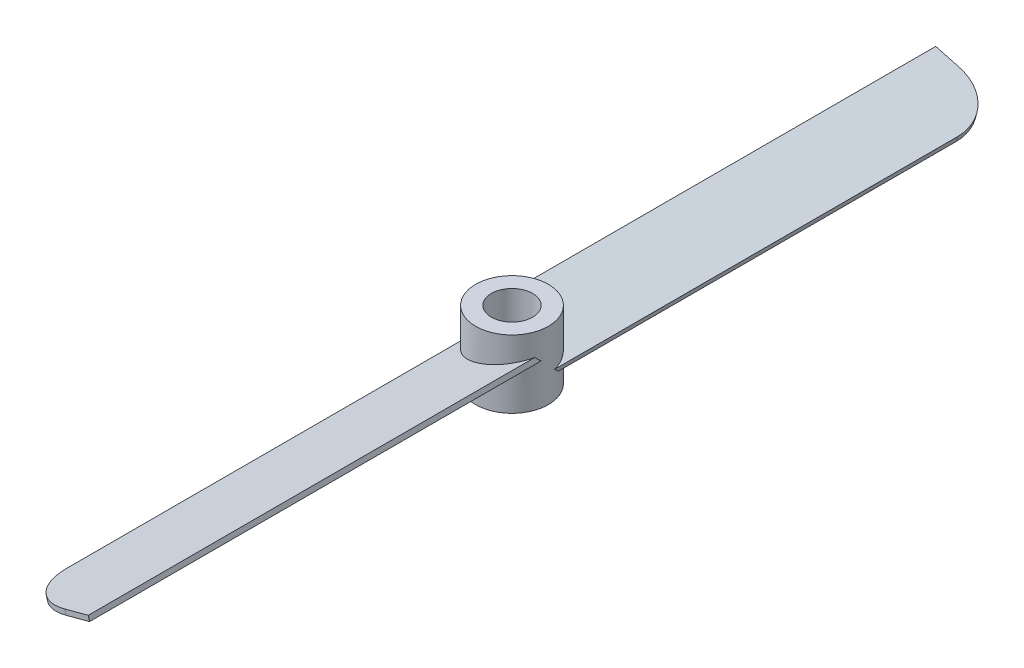
ISO-10303-21;
HEADER;
FILE_DESCRIPTION(('STEP AP214'),'2;1');
FILE_NAME('part.step','',(''),(''),'','','');
FILE_SCHEMA(('AUTOMOTIVE_DESIGN { 1 0 10303 214 1 1 1 1 }'));
ENDSEC;
DATA;
#1=APPLICATION_CONTEXT('core data for automotive mechanical design processes');
#2=APPLICATION_PROTOCOL_DEFINITION('international standard','automotive_design',2000,#1);
#3=PRODUCT_CONTEXT('',#1,'mechanical');
#4=PRODUCT('Part','Part','',(#3));
#5=PRODUCT_RELATED_PRODUCT_CATEGORY('part','',(#4));
#6=PRODUCT_DEFINITION_FORMATION('','',#4);
#7=PRODUCT_DEFINITION_CONTEXT('part definition',#1,'design');
#8=PRODUCT_DEFINITION('design','',#6,#7);
#9=PRODUCT_DEFINITION_SHAPE('','',#8);
#10=(LENGTH_UNIT() NAMED_UNIT(*) SI_UNIT(.MILLI.,.METRE.));
#11=(NAMED_UNIT(*) PLANE_ANGLE_UNIT() SI_UNIT($,.RADIAN.));
#12=(NAMED_UNIT(*) SI_UNIT($,.STERADIAN.) SOLID_ANGLE_UNIT());
#13=UNCERTAINTY_MEASURE_WITH_UNIT(LENGTH_MEASURE(1.E-05),#10,'distance_accuracy_value','');
#14=(GEOMETRIC_REPRESENTATION_CONTEXT(3) GLOBAL_UNCERTAINTY_ASSIGNED_CONTEXT((#13)) GLOBAL_UNIT_ASSIGNED_CONTEXT((#10,
#11,#12)) REPRESENTATION_CONTEXT('',''));
#15=CARTESIAN_POINT('',(0.,0.,0.));
#16=DIRECTION('',(0.,0.,1.));
#17=DIRECTION('',(1.,0.,0.));
#18=AXIS2_PLACEMENT_3D('',#15,#16,#17);
#19=CARTESIAN_POINT('',(0.,14.,0.));
#20=DIRECTION('',(0.,-1.,0.));
#21=DIRECTION('',(0.,0.,-1.));
#22=AXIS2_PLACEMENT_3D('',#19,#20,#21);
#23=CYLINDRICAL_SURFACE('',#22,7.5);
#24=CARTESIAN_POINT('',(0.,-21.9777747886716,0.));
#25=DIRECTION('',(-0.965925826289067,0.258819045102524,0.));
#26=DIRECTION('',(-0.258819045102524,-0.965925826289067,0.));
#27=AXIS2_PLACEMENT_3D('',#24,#25,#26);
#28=ELLIPSE('',#27,28.9777747886716,7.5);
#29=CARTESIAN_POINT('',(7.11046910095244,4.55885716173106,-2.38562972072381));
#30=VERTEX_POINT('',#29);
#31=CARTESIAN_POINT('',(7.37841829338357,5.55885716173106,-1.3449696977489));
#32=VERTEX_POINT('',#31);
#33=EDGE_CURVE('E124',#30,#32,#28,.F.);
#34=ORIENTED_EDGE('',*,*,#33,.T.);
#35=CARTESIAN_POINT('',(0.,7.53589838486225,0.));
#36=DIRECTION('',(0.258819045102525,0.965925826289067,0.));
#37=DIRECTION('',(0.965925826289067,-0.258819045102525,0.));
#38=AXIS2_PLACEMENT_3D('',#35,#36,#37);
#39=ELLIPSE('',#38,7.76457135307563,7.5);
#40=CARTESIAN_POINT('',(-7.11046910095244,9.44114283826893,-2.38562972072377));
#41=VERTEX_POINT('',#40);
#42=EDGE_CURVE('E116',#32,#41,#39,.T.);
#43=ORIENTED_EDGE('',*,*,#42,.T.);
#44=CARTESIAN_POINT('',(0.,35.9777747886716,0.));
#45=DIRECTION('',(-0.965925826289067,0.258819045102525,0.));
#46=DIRECTION('',(-0.258819045102525,-0.965925826289067,0.));
#47=AXIS2_PLACEMENT_3D('',#44,#45,#46);
#48=ELLIPSE('',#47,28.9777747886716,7.5);
#49=CARTESIAN_POINT('',(-7.37841829338357,8.44114283826893,-1.34496969774885));
#50=VERTEX_POINT('',#49);
#51=EDGE_CURVE('E121',#50,#41,#48,.F.);
#52=ORIENTED_EDGE('',*,*,#51,.F.);
#53=CARTESIAN_POINT('',(0.,6.46410161513775,0.));
#54=DIRECTION('',(0.258819045102525,0.965925826289067,0.));
#55=DIRECTION('',(0.965925826289067,-0.258819045102525,0.));
#56=AXIS2_PLACEMENT_3D('',#53,#54,#55);
#57=ELLIPSE('',#56,7.76457135307563,7.5);
#58=EDGE_CURVE('E127',#30,#50,#57,.T.);
#59=ORIENTED_EDGE('',*,*,#58,.F.);
#60=EDGE_LOOP('',(#34,#43,#52,#59));
#61=FACE_BOUND('',#60,.T.);
#62=CARTESIAN_POINT('',(0.,14.,0.));
#63=DIRECTION('',(0.,1.,0.));
#64=DIRECTION('',(0.,0.,1.));
#65=AXIS2_PLACEMENT_3D('',#62,#63,#64);
#66=CIRCLE('',#65,7.5);
#67=CARTESIAN_POINT('',(0.,14.,7.5));
#68=VERTEX_POINT('',#67);
#69=EDGE_CURVE('E203',#68,#68,#66,.T.);
#70=ORIENTED_EDGE('',*,*,#69,.F.);
#71=EDGE_LOOP('',(#70));
#72=FACE_BOUND('',#71,.T.);
#73=CARTESIAN_POINT('',(0.,0.,0.));
#74=DIRECTION('',(0.,1.,0.));
#75=DIRECTION('',(0.,0.,1.));
#76=AXIS2_PLACEMENT_3D('',#73,#74,#75);
#77=CIRCLE('',#76,7.5);
#78=CARTESIAN_POINT('',(0.,0.,7.5));
#79=VERTEX_POINT('',#78);
#80=EDGE_CURVE('E202',#79,#79,#77,.T.);
#81=ORIENTED_EDGE('',*,*,#80,.T.);
#82=EDGE_LOOP('',(#81));
#83=FACE_BOUND('',#82,.T.);
#84=CARTESIAN_POINT('',(0.,-21.9777747886716,0.));
#85=DIRECTION('',(0.965925826289067,0.258819045102524,0.));
#86=DIRECTION('',(0.258819045102525,-0.965925826289067,0.));
#87=AXIS2_PLACEMENT_3D('',#84,#85,#86);
#88=ELLIPSE('',#87,28.9777747886716,7.5);
#89=CARTESIAN_POINT('',(-7.11046910095244,4.55885716173106,2.38562972072381));
#90=VERTEX_POINT('',#89);
#91=CARTESIAN_POINT('',(-7.37841829338357,5.55885716173106,1.3449696977489));
#92=VERTEX_POINT('',#91);
#93=EDGE_CURVE('E166',#90,#92,#88,.F.);
#94=ORIENTED_EDGE('',*,*,#93,.T.);
#95=CARTESIAN_POINT('',(0.,7.53589838486225,0.));
#96=DIRECTION('',(-0.258819045102525,0.965925826289067,0.));
#97=DIRECTION('',(-0.965925826289067,-0.258819045102525,0.));
#98=AXIS2_PLACEMENT_3D('',#95,#96,#97);
#99=ELLIPSE('',#98,7.76457135307563,7.5);
#100=CARTESIAN_POINT('',(7.11046910095244,9.44114283826893,2.38562972072377));
#101=VERTEX_POINT('',#100);
#102=EDGE_CURVE('E213',#92,#101,#99,.T.);
#103=ORIENTED_EDGE('',*,*,#102,.T.);
#104=CARTESIAN_POINT('',(0.,35.9777747886716,0.));
#105=DIRECTION('',(0.965925826289067,0.258819045102525,0.));
#106=DIRECTION('',(0.258819045102525,-0.965925826289067,0.));
#107=AXIS2_PLACEMENT_3D('',#104,#105,#106);
#108=ELLIPSE('',#107,28.9777747886716,7.5);
#109=CARTESIAN_POINT('',(7.37841829338357,8.44114283826893,1.34496969774889));
#110=VERTEX_POINT('',#109);
#111=EDGE_CURVE('E157',#110,#101,#108,.F.);
#112=ORIENTED_EDGE('',*,*,#111,.F.);
#113=CARTESIAN_POINT('',(0.,6.46410161513775,0.));
#114=DIRECTION('',(-0.258819045102525,0.965925826289067,0.));
#115=DIRECTION('',(-0.965925826289067,-0.258819045102525,0.));
#116=AXIS2_PLACEMENT_3D('',#113,#114,#115);
#117=ELLIPSE('',#116,7.76457135307563,7.5);
#118=EDGE_CURVE('E207',#90,#110,#117,.T.);
#119=ORIENTED_EDGE('',*,*,#118,.F.);
#120=EDGE_LOOP('',(#94,#103,#112,#119));
#121=FACE_BOUND('',#120,.T.);
#122=ADVANCED_FACE('F39',(#61,#72,#83,#121),#23,.T.);
#123=CARTESIAN_POINT('',(0.,14.,0.));
#124=DIRECTION('',(0.,1.,0.));
#125=DIRECTION('',(0.,0.,1.));
#126=AXIS2_PLACEMENT_3D('',#123,#124,#125);
#127=PLANE('',#126);
#128=CARTESIAN_POINT('',(0.,14.,0.));
#129=DIRECTION('',(0.,1.,0.));
#130=DIRECTION('',(0.,0.,1.));
#131=AXIS2_PLACEMENT_3D('',#128,#129,#130);
#132=CIRCLE('',#131,4.25);
#133=CARTESIAN_POINT('',(0.,14.,4.25));
#134=VERTEX_POINT('',#133);
#135=EDGE_CURVE('E184',#134,#134,#132,.T.);
#136=ORIENTED_EDGE('',*,*,#135,.F.);
#137=EDGE_LOOP('',(#136));
#138=FACE_BOUND('',#137,.T.);
#139=ORIENTED_EDGE('',*,*,#69,.T.);
#140=EDGE_LOOP('',(#139));
#141=FACE_BOUND('',#140,.T.);
#142=ADVANCED_FACE('F254',(#138,#141),#127,.T.);
#143=CARTESIAN_POINT('',(0.,0.,0.));
#144=DIRECTION('',(0.,1.,0.));
#145=DIRECTION('',(0.,0.,1.));
#146=AXIS2_PLACEMENT_3D('',#143,#144,#145);
#147=PLANE('',#146);
#148=CARTESIAN_POINT('',(0.,0.,0.));
#149=DIRECTION('',(0.,1.,0.));
#150=DIRECTION('',(0.,0.,1.));
#151=AXIS2_PLACEMENT_3D('',#148,#149,#150);
#152=CIRCLE('',#151,4.25);
#153=CARTESIAN_POINT('',(0.,0.,4.25));
#154=VERTEX_POINT('',#153);
#155=EDGE_CURVE('E198',#154,#154,#152,.F.);
#156=ORIENTED_EDGE('',*,*,#155,.F.);
#157=EDGE_LOOP('',(#156));
#158=FACE_BOUND('',#157,.T.);
#159=ORIENTED_EDGE('',*,*,#80,.F.);
#160=EDGE_LOOP('',(#159));
#161=FACE_BOUND('',#160,.T.);
#162=ADVANCED_FACE('F259',(#158,#161),#147,.F.);
#163=CARTESIAN_POINT('',(0.,-0.000999999999999265,0.));
#164=DIRECTION('',(0.,1.,0.));
#165=DIRECTION('',(0.,0.,1.));
#166=AXIS2_PLACEMENT_3D('',#163,#164,#165);
#167=CYLINDRICAL_SURFACE('',#166,4.25);
#168=CARTESIAN_POINT('',(0.,14.,4.25));
#169=CARTESIAN_POINT('',(0.,13.8541666666667,4.25));
#170=CARTESIAN_POINT('',(0.,13.7083333333333,4.25));
#171=CARTESIAN_POINT('',(0.,13.4166666666667,4.25));
#172=CARTESIAN_POINT('',(0.,13.2708333333333,4.25));
#173=CARTESIAN_POINT('',(0.,12.9791666666667,4.25));
#174=CARTESIAN_POINT('',(0.,12.8333333333333,4.25));
#175=CARTESIAN_POINT('',(0.,12.5416666666667,4.25));
#176=CARTESIAN_POINT('',(0.,12.3958333333333,4.25));
#177=CARTESIAN_POINT('',(0.,12.1041666666667,4.25));
#178=CARTESIAN_POINT('',(0.,11.9583333333333,4.25));
#179=CARTESIAN_POINT('',(0.,11.6666666666667,4.25));
#180=CARTESIAN_POINT('',(0.,11.5208333333333,4.25));
#181=CARTESIAN_POINT('',(0.,11.2291666666667,4.25));
#182=CARTESIAN_POINT('',(0.,11.0833333333333,4.25));
#183=CARTESIAN_POINT('',(0.,10.7916666666667,4.25));
#184=CARTESIAN_POINT('',(0.,10.6458333333333,4.25));
#185=CARTESIAN_POINT('',(0.,10.3541666666667,4.25));
#186=CARTESIAN_POINT('',(0.,10.2083333333333,4.25));
#187=CARTESIAN_POINT('',(0.,9.91666666666667,4.25));
#188=CARTESIAN_POINT('',(0.,9.77083333333333,4.25));
#189=CARTESIAN_POINT('',(0.,9.47916666666667,4.25));
#190=CARTESIAN_POINT('',(0.,9.33333333333333,4.25));
#191=CARTESIAN_POINT('',(0.,9.04166666666666,4.25));
#192=CARTESIAN_POINT('',(0.,8.89583333333333,4.25));
#193=CARTESIAN_POINT('',(0.,8.60416666666666,4.25));
#194=CARTESIAN_POINT('',(0.,8.45833333333333,4.25));
#195=CARTESIAN_POINT('',(0.,8.16666666666667,4.25));
#196=CARTESIAN_POINT('',(0.,8.02083333333333,4.25));
#197=CARTESIAN_POINT('',(0.,7.72916666666667,4.25));
#198=CARTESIAN_POINT('',(0.,7.58333333333333,4.25));
#199=CARTESIAN_POINT('',(0.,7.29166666666667,4.25));
#200=CARTESIAN_POINT('',(0.,7.14583333333333,4.25));
#201=CARTESIAN_POINT('',(0.,6.85416666666667,4.25));
#202=CARTESIAN_POINT('',(0.,6.70833333333333,4.25));
#203=CARTESIAN_POINT('',(0.,6.41666666666667,4.25));
#204=CARTESIAN_POINT('',(0.,6.27083333333333,4.25));
#205=CARTESIAN_POINT('',(0.,5.97916666666667,4.25));
#206=CARTESIAN_POINT('',(0.,5.83333333333333,4.25));
#207=CARTESIAN_POINT('',(0.,5.54166666666667,4.25));
#208=CARTESIAN_POINT('',(0.,5.39583333333333,4.25));
#209=CARTESIAN_POINT('',(0.,5.10416666666667,4.25));
#210=CARTESIAN_POINT('',(0.,4.95833333333333,4.25));
#211=CARTESIAN_POINT('',(0.,4.66666666666667,4.25));
#212=CARTESIAN_POINT('',(0.,4.52083333333333,4.25));
#213=CARTESIAN_POINT('',(0.,4.22916666666667,4.25));
#214=CARTESIAN_POINT('',(0.,4.08333333333333,4.25));
#215=CARTESIAN_POINT('',(0.,3.79166666666667,4.25));
#216=CARTESIAN_POINT('',(0.,3.64583333333333,4.25));
#217=CARTESIAN_POINT('',(0.,3.35416666666667,4.25));
#218=CARTESIAN_POINT('',(0.,3.20833333333333,4.25));
#219=CARTESIAN_POINT('',(0.,2.91666666666667,4.25));
#220=CARTESIAN_POINT('',(0.,2.77083333333333,4.25));
#221=CARTESIAN_POINT('',(0.,2.47916666666667,4.25));
#222=CARTESIAN_POINT('',(0.,2.33333333333333,4.25));
#223=CARTESIAN_POINT('',(0.,2.04166666666667,4.25));
#224=CARTESIAN_POINT('',(0.,1.89583333333333,4.25));
#225=CARTESIAN_POINT('',(0.,1.60416666666667,4.25));
#226=CARTESIAN_POINT('',(0.,1.45833333333333,4.25));
#227=CARTESIAN_POINT('',(0.,1.16666666666667,4.25));
#228=CARTESIAN_POINT('',(0.,1.02083333333333,4.25));
#229=CARTESIAN_POINT('',(0.,0.729166666666667,4.25));
#230=CARTESIAN_POINT('',(0.,0.583333333333334,4.25));
#231=CARTESIAN_POINT('',(0.,0.291666666666667,4.25));
#232=CARTESIAN_POINT('',(0.,0.145833333333333,4.25));
#233=CARTESIAN_POINT('',(0.,0.,4.25));
#234=B_SPLINE_CURVE_WITH_KNOTS('',3,(#168,#169,#170,#171,#172,#173,#174,#175,#176,#177,#178,
#179,#180,#181,#182,#183,#184,#185,#186,#187,#188,#189,#190,#191,#192,#193,#194,#195,#196,#197,
#198,#199,#200,#201,#202,#203,#204,#205,#206,#207,#208,#209,#210,#211,#212,#213,#214,#215,#216,
#217,#218,#219,#220,#221,#222,#223,#224,#225,#226,#227,#228,#229,#230,#231,#232,#233),
.UNSPECIFIED.,.F.,.F.,(4,2,2,2,2,2,2,2,2,2,2,2,2,2,2,2,2,2,2,2,2,2,2,2,2,2,2,2,2,2,2,2,4),(0.,
0.4375,0.875000000000001,1.3125,1.75,2.1875,2.625,3.0625,3.5,3.9375,4.375,4.8125,5.25,5.6875,
6.125,6.5625,7.,7.4375,7.875,8.3125,8.75,9.1875,9.625,10.0625,10.5,10.9375,11.375,11.8125,12.25,
12.6875,13.125,13.5625,14.),.UNSPECIFIED.);
#235=EDGE_CURVE('BSEAM298',#134,#154,#234,.T.);
#236=ORIENTED_EDGE('',*,*,#135,.T.);
#237=ORIENTED_EDGE('',*,*,#155,.T.);
#238=ORIENTED_EDGE('',*,*,#235,.T.);
#239=ORIENTED_EDGE('',*,*,#235,.F.);
#240=EDGE_LOOP('',(#236,#238,#237,#239));
#241=FACE_BOUND('',#240,.T.);
#242=ADVANCED_FACE('F298',(#241),#167,.F.);
#243=CARTESIAN_POINT('',(-7.37841829338357,5.55885716173106,94.5));
#244=DIRECTION('',(-0.258819045102525,0.965925826289067,0.));
#245=DIRECTION('',(-0.965925826289067,-0.258819045102525,0.));
#246=AXIS2_PLACEMENT_3D('',#243,#244,#245);
#247=PLANE('',#246);
#248=DIRECTION('',(0.,0.,-1.));
#249=VECTOR('',#248,1.);
#250=CARTESIAN_POINT('',(-7.37841829338357,5.55885716173106,94.5));
#251=LINE('',#250,#249);
#252=CARTESIAN_POINT('',(-7.37841829338357,5.55885716173106,84.5));
#253=VERTEX_POINT('',#252);
#254=EDGE_CURVE('E181',#253,#92,#251,.T.);
#255=ORIENTED_EDGE('',*,*,#254,.F.);
#256=CARTESIAN_POINT('',(2.28083996950711,8.14704761275631,84.5));
#257=DIRECTION('',(-0.258819045102525,0.965925826289067,0.));
#258=DIRECTION('',(-0.965925826289067,-0.258819045102525,0.));
#259=AXIS2_PLACEMENT_3D('',#256,#257,#258);
#260=CIRCLE('',#259,10.);
#261=CARTESIAN_POINT('',(2.2808399695071,8.14704761275631,94.5));
#262=VERTEX_POINT('',#261);
#263=EDGE_CURVE('E220',#253,#262,#260,.T.);
#264=ORIENTED_EDGE('',*,*,#263,.T.);
#265=DIRECTION('',(0.965925826289067,0.258819045102525,0.));
#266=VECTOR('',#265,1.);
#267=CARTESIAN_POINT('',(-7.37841829338357,5.55885716173106,94.5));
#268=LINE('',#267,#266);
#269=CARTESIAN_POINT('',(7.11046910095244,9.44114283826893,94.5));
#270=VERTEX_POINT('',#269);
#271=EDGE_CURVE('E170',#262,#270,#268,.T.);
#272=ORIENTED_EDGE('',*,*,#271,.T.);
#273=DIRECTION('',(0.,0.,-1.));
#274=VECTOR('',#273,1.);
#275=CARTESIAN_POINT('',(7.11046910095244,9.44114283826893,94.5));
#276=LINE('',#275,#274);
#277=EDGE_CURVE('E180',#270,#101,#276,.T.);
#278=ORIENTED_EDGE('',*,*,#277,.T.);
#279=ORIENTED_EDGE('',*,*,#102,.F.);
#280=EDGE_LOOP('',(#255,#264,#272,#278,#279));
#281=FACE_BOUND('',#280,.T.);
#282=ADVANCED_FACE('F296',(#281),#247,.T.);
#283=CARTESIAN_POINT('',(-7.11046910095244,4.55885716173106,94.5));
#284=DIRECTION('',(-0.258819045102525,0.965925826289067,0.));
#285=DIRECTION('',(-0.965925826289067,-0.258819045102525,0.));
#286=AXIS2_PLACEMENT_3D('',#283,#284,#285);
#287=PLANE('',#286);
#288=DIRECTION('',(0.965925826289067,0.258819045102525,0.));
#289=VECTOR('',#288,1.);
#290=CARTESIAN_POINT('',(-7.11046910095244,4.55885716173106,94.5));
#291=LINE('',#290,#289);
#292=CARTESIAN_POINT('',(2.54878916193823,7.14704761275631,94.5));
#293=VERTEX_POINT('',#292);
#294=CARTESIAN_POINT('',(7.37841829338357,8.44114283826893,94.5));
#295=VERTEX_POINT('',#294);
#296=EDGE_CURVE('E177',#293,#295,#291,.T.);
#297=ORIENTED_EDGE('',*,*,#296,.F.);
#298=CARTESIAN_POINT('',(2.54878916193823,7.14704761275631,84.5));
#299=DIRECTION('',(-0.258819045102525,0.965925826289067,0.));
#300=DIRECTION('',(-0.965925826289067,-0.258819045102525,0.));
#301=AXIS2_PLACEMENT_3D('',#298,#299,#300);
#302=CIRCLE('',#301,10.);
#303=CARTESIAN_POINT('',(-7.11046910095244,4.55885716173106,84.5));
#304=VERTEX_POINT('',#303);
#305=EDGE_CURVE('E226',#293,#304,#302,.F.);
#306=ORIENTED_EDGE('',*,*,#305,.T.);
#307=DIRECTION('',(0.,0.,-1.));
#308=VECTOR('',#307,1.);
#309=CARTESIAN_POINT('',(-7.11046910095244,4.55885716173106,94.5));
#310=LINE('',#309,#308);
#311=EDGE_CURVE('E185',#304,#90,#310,.T.);
#312=ORIENTED_EDGE('',*,*,#311,.T.);
#313=ORIENTED_EDGE('',*,*,#118,.T.);
#314=DIRECTION('',(0.,0.,-1.));
#315=VECTOR('',#314,1.);
#316=CARTESIAN_POINT('',(7.37841829338357,8.44114283826893,94.5));
#317=LINE('',#316,#315);
#318=EDGE_CURVE('E188',#295,#110,#317,.T.);
#319=ORIENTED_EDGE('',*,*,#318,.F.);
#320=EDGE_LOOP('',(#297,#306,#312,#313,#319));
#321=FACE_BOUND('',#320,.T.);
#322=ADVANCED_FACE('F281',(#321),#287,.F.);
#323=CARTESIAN_POINT('',(-7.11046910095244,4.55885716173106,94.5));
#324=DIRECTION('',(-0.965925826289067,-0.258819045102524,0.));
#325=DIRECTION('',(0.258819045102524,-0.965925826289067,0.));
#326=AXIS2_PLACEMENT_3D('',#323,#324,#325);
#327=PLANE('',#326);
#328=ORIENTED_EDGE('',*,*,#311,.F.);
#329=DIRECTION('',(-0.258819045102524,0.965925826289067,0.));
#330=VECTOR('',#329,1.);
#331=CARTESIAN_POINT('',(-7.11046910095244,4.55885716173106,84.5));
#332=LINE('',#331,#330);
#333=EDGE_CURVE('E216',#304,#253,#332,.T.);
#334=ORIENTED_EDGE('',*,*,#333,.T.);
#335=ORIENTED_EDGE('',*,*,#254,.T.);
#336=ORIENTED_EDGE('',*,*,#93,.F.);
#337=EDGE_LOOP('',(#328,#334,#335,#336));
#338=FACE_BOUND('',#337,.T.);
#339=ADVANCED_FACE('F286',(#338),#327,.T.);
#340=CARTESIAN_POINT('',(7.37841829338357,8.44114283826893,94.5));
#341=DIRECTION('',(-0.965925826289067,-0.258819045102525,0.));
#342=DIRECTION('',(0.258819045102525,-0.965925826289067,0.));
#343=AXIS2_PLACEMENT_3D('',#340,#341,#342);
#344=PLANE('',#343);
#345=ORIENTED_EDGE('',*,*,#318,.T.);
#346=ORIENTED_EDGE('',*,*,#111,.T.);
#347=ORIENTED_EDGE('',*,*,#277,.F.);
#348=DIRECTION('',(-0.258819045102525,0.965925826289067,0.));
#349=VECTOR('',#348,1.);
#350=CARTESIAN_POINT('',(7.37841829338357,8.44114283826893,94.5));
#351=LINE('',#350,#349);
#352=EDGE_CURVE('E173',#295,#270,#351,.T.);
#353=ORIENTED_EDGE('',*,*,#352,.F.);
#354=EDGE_LOOP('',(#345,#346,#347,#353));
#355=FACE_BOUND('',#354,.T.);
#356=ADVANCED_FACE('F272',(#355),#344,.F.);
#357=CARTESIAN_POINT('',(0.,0.,94.5));
#358=DIRECTION('',(0.,0.,1.));
#359=DIRECTION('',(1.,0.,0.));
#360=AXIS2_PLACEMENT_3D('',#357,#358,#359);
#361=PLANE('',#360);
#362=ORIENTED_EDGE('',*,*,#271,.F.);
#363=DIRECTION('',(-0.258819045102524,0.965925826289067,0.));
#364=VECTOR('',#363,1.);
#365=CARTESIAN_POINT('',(4.16481456572269,1.11595869951079,94.5));
#366=LINE('',#365,#364);
#367=EDGE_CURVE('E223',#262,#293,#366,.F.);
#368=ORIENTED_EDGE('',*,*,#367,.T.);
#369=ORIENTED_EDGE('',*,*,#296,.T.);
#370=ORIENTED_EDGE('',*,*,#352,.T.);
#371=EDGE_LOOP('',(#362,#368,#369,#370));
#372=FACE_BOUND('',#371,.T.);
#373=ADVANCED_FACE('F265',(#372),#361,.T.);
#374=CARTESIAN_POINT('',(2.54878916193823,7.14704761275631,84.5));
#375=DIRECTION('',(-0.258819045102524,0.965925826289067,0.));
#376=DIRECTION('',(-0.965925826289067,-0.258819045102524,0.));
#377=AXIS2_PLACEMENT_3D('',#374,#375,#376);
#378=CYLINDRICAL_SURFACE('',#377,10.);
#379=ORIENTED_EDGE('',*,*,#305,.F.);
#380=ORIENTED_EDGE('',*,*,#367,.F.);
#381=ORIENTED_EDGE('',*,*,#263,.F.);
#382=ORIENTED_EDGE('',*,*,#333,.F.);
#383=EDGE_LOOP('',(#379,#380,#381,#382));
#384=FACE_BOUND('',#383,.T.);
#385=ADVANCED_FACE('F263',(#384),#378,.T.);
#386=CARTESIAN_POINT('',(7.37841829338357,5.55885716173106,-94.5));
#387=DIRECTION('',(0.258819045102525,0.965925826289067,0.));
#388=DIRECTION('',(-0.965925826289067,0.258819045102525,0.));
#389=AXIS2_PLACEMENT_3D('',#386,#387,#388);
#390=PLANE('',#389);
#391=DIRECTION('',(0.,0.,1.));
#392=VECTOR('',#391,1.);
#393=CARTESIAN_POINT('',(7.37841829338357,5.55885716173106,-94.5));
#394=LINE('',#393,#392);
#395=CARTESIAN_POINT('',(7.37841829338357,5.55885716173106,-84.5));
#396=VERTEX_POINT('',#395);
#397=EDGE_CURVE('E154',#396,#32,#394,.T.);
#398=ORIENTED_EDGE('',*,*,#397,.F.);
#399=CARTESIAN_POINT('',(-2.28083996950711,8.14704761275631,-84.5));
#400=DIRECTION('',(0.258819045102525,0.965925826289067,0.));
#401=DIRECTION('',(-0.965925826289067,0.258819045102525,0.));
#402=AXIS2_PLACEMENT_3D('',#399,#400,#401);
#403=CIRCLE('',#402,10.);
#404=CARTESIAN_POINT('',(-2.2808399695071,8.14704761275631,-94.5));
#405=VERTEX_POINT('',#404);
#406=EDGE_CURVE('E62',#396,#405,#403,.T.);
#407=ORIENTED_EDGE('',*,*,#406,.T.);
#408=DIRECTION('',(-0.965925826289067,0.258819045102525,0.));
#409=VECTOR('',#408,1.);
#410=CARTESIAN_POINT('',(7.37841829338357,5.55885716173106,-94.5));
#411=LINE('',#410,#409);
#412=CARTESIAN_POINT('',(-7.11046910095244,9.44114283826893,-94.5));
#413=VERTEX_POINT('',#412);
#414=EDGE_CURVE('E132',#405,#413,#411,.T.);
#415=ORIENTED_EDGE('',*,*,#414,.T.);
#416=DIRECTION('',(0.,0.,1.));
#417=VECTOR('',#416,1.);
#418=CARTESIAN_POINT('',(-7.11046910095244,9.44114283826893,-94.5));
#419=LINE('',#418,#417);
#420=EDGE_CURVE('E130',#413,#41,#419,.T.);
#421=ORIENTED_EDGE('',*,*,#420,.T.);
#422=ORIENTED_EDGE('',*,*,#42,.F.);
#423=EDGE_LOOP('',(#398,#407,#415,#421,#422));
#424=FACE_BOUND('',#423,.T.);
#425=ADVANCED_FACE('F131',(#424),#390,.T.);
#426=CARTESIAN_POINT('',(7.11046910095244,4.55885716173106,-94.5));
#427=DIRECTION('',(0.258819045102525,0.965925826289067,0.));
#428=DIRECTION('',(-0.965925826289067,0.258819045102525,0.));
#429=AXIS2_PLACEMENT_3D('',#426,#427,#428);
#430=PLANE('',#429);
#431=DIRECTION('',(-0.965925826289067,0.258819045102525,0.));
#432=VECTOR('',#431,1.);
#433=CARTESIAN_POINT('',(7.11046910095244,4.55885716173106,-94.5));
#434=LINE('',#433,#432);
#435=CARTESIAN_POINT('',(-2.54878916193823,7.14704761275631,-94.5));
#436=VERTEX_POINT('',#435);
#437=CARTESIAN_POINT('',(-7.37841829338357,8.44114283826893,-94.5));
#438=VERTEX_POINT('',#437);
#439=EDGE_CURVE('E138',#436,#438,#434,.T.);
#440=ORIENTED_EDGE('',*,*,#439,.F.);
#441=CARTESIAN_POINT('',(-2.54878916193823,7.14704761275631,-84.5));
#442=DIRECTION('',(0.258819045102525,0.965925826289067,0.));
#443=DIRECTION('',(-0.965925826289067,0.258819045102525,0.));
#444=AXIS2_PLACEMENT_3D('',#441,#442,#443);
#445=CIRCLE('',#444,10.);
#446=CARTESIAN_POINT('',(7.11046910095244,4.55885716173106,-84.5));
#447=VERTEX_POINT('',#446);
#448=EDGE_CURVE('E11',#436,#447,#445,.F.);
#449=ORIENTED_EDGE('',*,*,#448,.T.);
#450=DIRECTION('',(0.,0.,1.));
#451=VECTOR('',#450,1.);
#452=CARTESIAN_POINT('',(7.11046910095244,4.55885716173106,-94.5));
#453=LINE('',#452,#451);
#454=EDGE_CURVE('E158',#447,#30,#453,.T.);
#455=ORIENTED_EDGE('',*,*,#454,.T.);
#456=ORIENTED_EDGE('',*,*,#58,.T.);
#457=DIRECTION('',(0.,0.,1.));
#458=VECTOR('',#457,1.);
#459=CARTESIAN_POINT('',(-7.37841829338357,8.44114283826893,-94.5));
#460=LINE('',#459,#458);
#461=EDGE_CURVE('E137',#438,#50,#460,.T.);
#462=ORIENTED_EDGE('',*,*,#461,.F.);
#463=EDGE_LOOP('',(#440,#449,#455,#456,#462));
#464=FACE_BOUND('',#463,.T.);
#465=ADVANCED_FACE('F243',(#464),#430,.F.);
#466=CARTESIAN_POINT('',(7.11046910095244,4.55885716173106,-94.5));
#467=DIRECTION('',(0.965925826289067,-0.258819045102524,0.));
#468=DIRECTION('',(0.258819045102524,0.965925826289067,0.));
#469=AXIS2_PLACEMENT_3D('',#466,#467,#468);
#470=PLANE('',#469);
#471=ORIENTED_EDGE('',*,*,#454,.F.);
#472=DIRECTION('',(0.258819045102524,0.965925826289067,0.));
#473=VECTOR('',#472,1.);
#474=CARTESIAN_POINT('',(7.11046910095244,4.55885716173106,-84.5));
#475=LINE('',#474,#473);
#476=EDGE_CURVE('E126',#447,#396,#475,.T.);
#477=ORIENTED_EDGE('',*,*,#476,.T.);
#478=ORIENTED_EDGE('',*,*,#397,.T.);
#479=ORIENTED_EDGE('',*,*,#33,.F.);
#480=EDGE_LOOP('',(#471,#477,#478,#479));
#481=FACE_BOUND('',#480,.T.);
#482=ADVANCED_FACE('F239',(#481),#470,.T.);
#483=CARTESIAN_POINT('',(-7.37841829338357,8.44114283826893,-94.5));
#484=DIRECTION('',(0.965925826289067,-0.258819045102525,0.));
#485=DIRECTION('',(0.258819045102525,0.965925826289067,0.));
#486=AXIS2_PLACEMENT_3D('',#483,#484,#485);
#487=PLANE('',#486);
#488=ORIENTED_EDGE('',*,*,#461,.T.);
#489=ORIENTED_EDGE('',*,*,#51,.T.);
#490=ORIENTED_EDGE('',*,*,#420,.F.);
#491=DIRECTION('',(0.258819045102525,0.965925826289067,0.));
#492=VECTOR('',#491,1.);
#493=CARTESIAN_POINT('',(-7.37841829338357,8.44114283826893,-94.5));
#494=LINE('',#493,#492);
#495=EDGE_CURVE('E149',#438,#413,#494,.T.);
#496=ORIENTED_EDGE('',*,*,#495,.F.);
#497=EDGE_LOOP('',(#488,#489,#490,#496));
#498=FACE_BOUND('',#497,.T.);
#499=ADVANCED_FACE('F140',(#498),#487,.F.);
#500=CARTESIAN_POINT('',(0.,0.,-94.5));
#501=DIRECTION('',(0.,0.,-1.));
#502=DIRECTION('',(-1.,0.,0.));
#503=AXIS2_PLACEMENT_3D('',#500,#501,#502);
#504=PLANE('',#503);
#505=ORIENTED_EDGE('',*,*,#414,.F.);
#506=DIRECTION('',(0.258819045102524,0.965925826289067,0.));
#507=VECTOR('',#506,1.);
#508=CARTESIAN_POINT('',(-4.16481456572269,1.11595869951079,-94.5));
#509=LINE('',#508,#507);
#510=EDGE_CURVE('E48',#405,#436,#509,.F.);
#511=ORIENTED_EDGE('',*,*,#510,.T.);
#512=ORIENTED_EDGE('',*,*,#439,.T.);
#513=ORIENTED_EDGE('',*,*,#495,.T.);
#514=EDGE_LOOP('',(#505,#511,#512,#513));
#515=FACE_BOUND('',#514,.T.);
#516=ADVANCED_FACE('F244',(#515),#504,.T.);
#517=CARTESIAN_POINT('',(-2.54878916193823,7.14704761275631,-84.5));
#518=DIRECTION('',(0.258819045102524,0.965925826289067,0.));
#519=DIRECTION('',(-0.965925826289067,0.258819045102524,0.));
#520=AXIS2_PLACEMENT_3D('',#517,#518,#519);
#521=CYLINDRICAL_SURFACE('',#520,10.);
#522=ORIENTED_EDGE('',*,*,#448,.F.);
#523=ORIENTED_EDGE('',*,*,#510,.F.);
#524=ORIENTED_EDGE('',*,*,#406,.F.);
#525=ORIENTED_EDGE('',*,*,#476,.F.);
#526=EDGE_LOOP('',(#522,#523,#524,#525));
#527=FACE_BOUND('',#526,.T.);
#528=ADVANCED_FACE('F41',(#527),#521,.T.);
#529=CLOSED_SHELL('',(#122,#142,#162,#242,#282,#322,#339,#356,#373,#385,#425,#465,#482,#499,
#516,#528));
#530=MANIFOLD_SOLID_BREP('B2',#529);
#531=ADVANCED_BREP_SHAPE_REPRESENTATION('',(#18,#530),#14);
#532=SHAPE_DEFINITION_REPRESENTATION(#9,#531);
ENDSEC;
END-ISO-10303-21;
